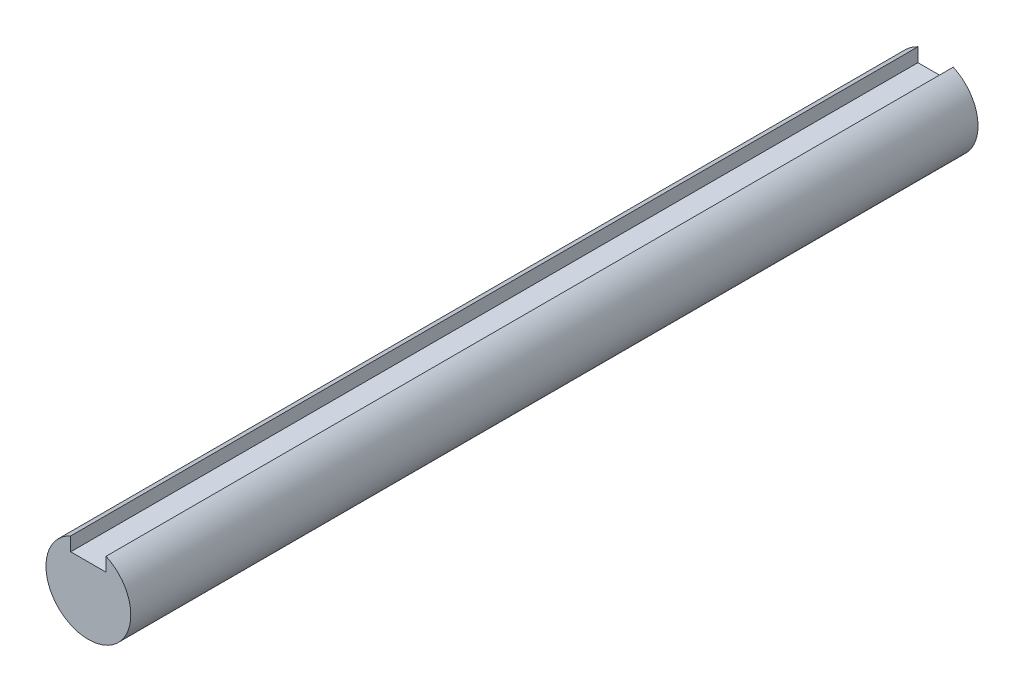
ISO-10303-21;
HEADER;
FILE_DESCRIPTION(('STEP AP214'),'2;1');
FILE_NAME('part.step','',(''),(''),'','','');
FILE_SCHEMA(('AUTOMOTIVE_DESIGN { 1 0 10303 214 1 1 1 1 }'));
ENDSEC;
DATA;
#1=APPLICATION_CONTEXT('core data for automotive mechanical design processes');
#2=APPLICATION_PROTOCOL_DEFINITION('international standard','automotive_design',2000,#1);
#3=PRODUCT_CONTEXT('',#1,'mechanical');
#4=PRODUCT('Part','Part','',(#3));
#5=PRODUCT_RELATED_PRODUCT_CATEGORY('part','',(#4));
#6=PRODUCT_DEFINITION_FORMATION('','',#4);
#7=PRODUCT_DEFINITION_CONTEXT('part definition',#1,'design');
#8=PRODUCT_DEFINITION('design','',#6,#7);
#9=PRODUCT_DEFINITION_SHAPE('','',#8);
#10=(LENGTH_UNIT() NAMED_UNIT(*) SI_UNIT(.MILLI.,.METRE.));
#11=(NAMED_UNIT(*) PLANE_ANGLE_UNIT() SI_UNIT($,.RADIAN.));
#12=(NAMED_UNIT(*) SI_UNIT($,.STERADIAN.) SOLID_ANGLE_UNIT());
#13=UNCERTAINTY_MEASURE_WITH_UNIT(LENGTH_MEASURE(1.E-05),#10,'distance_accuracy_value','');
#14=(GEOMETRIC_REPRESENTATION_CONTEXT(3) GLOBAL_UNCERTAINTY_ASSIGNED_CONTEXT((#13)) GLOBAL_UNIT_ASSIGNED_CONTEXT((#10,
#11,#12)) REPRESENTATION_CONTEXT('',''));
#15=CARTESIAN_POINT('',(0.,0.,0.));
#16=DIRECTION('',(0.,0.,1.));
#17=DIRECTION('',(1.,0.,0.));
#18=AXIS2_PLACEMENT_3D('',#15,#16,#17);
#19=CARTESIAN_POINT('',(-2.5,0.,59.944));
#20=DIRECTION('',(1.,0.,0.));
#21=DIRECTION('',(0.,1.,0.));
#22=AXIS2_PLACEMENT_3D('',#19,#20,#21);
#23=PLANE('',#22);
#24=DIRECTION('',(0.,-1.,0.));
#25=VECTOR('',#24,1.);
#26=CARTESIAN_POINT('',(-2.5,0.,-59.944));
#27=LINE('',#26,#25);
#28=CARTESIAN_POINT('',(-2.5,5.45435605731786,-59.944));
#29=VERTEX_POINT('',#28);
#30=CARTESIAN_POINT('',(-2.5,3.5,-59.944));
#31=VERTEX_POINT('',#30);
#32=EDGE_CURVE('E101',#29,#31,#27,.T.);
#33=ORIENTED_EDGE('',*,*,#32,.F.);
#34=DIRECTION('',(0.,0.,-1.));
#35=VECTOR('',#34,1.);
#36=CARTESIAN_POINT('',(-2.5,5.45435605731786,59.944));
#37=LINE('',#36,#35);
#38=CARTESIAN_POINT('',(-2.5,5.45435605731786,59.944));
#39=VERTEX_POINT('',#38);
#40=EDGE_CURVE('E11',#39,#29,#37,.T.);
#41=ORIENTED_EDGE('',*,*,#40,.F.);
#42=DIRECTION('',(0.,-1.,0.));
#43=VECTOR('',#42,1.);
#44=CARTESIAN_POINT('',(-2.5,0.,59.944));
#45=LINE('',#44,#43);
#46=CARTESIAN_POINT('',(-2.5,3.5,59.944));
#47=VERTEX_POINT('',#46);
#48=EDGE_CURVE('E86',#39,#47,#45,.T.);
#49=ORIENTED_EDGE('',*,*,#48,.T.);
#50=DIRECTION('',(0.,0.,-1.));
#51=VECTOR('',#50,1.);
#52=CARTESIAN_POINT('',(-2.5,3.5,59.944));
#53=LINE('',#52,#51);
#54=EDGE_CURVE('E54',#47,#31,#53,.T.);
#55=ORIENTED_EDGE('',*,*,#54,.T.);
#56=EDGE_LOOP('',(#33,#41,#49,#55));
#57=FACE_BOUND('',#56,.T.);
#58=ADVANCED_FACE('F38',(#57),#23,.T.);
#59=CARTESIAN_POINT('',(0.,0.,59.944));
#60=DIRECTION('',(0.,0.,-1.));
#61=DIRECTION('',(-1.,0.,0.));
#62=AXIS2_PLACEMENT_3D('',#59,#60,#61);
#63=CYLINDRICAL_SURFACE('',#62,6.);
#64=CARTESIAN_POINT('',(0.,0.,-59.944));
#65=DIRECTION('',(0.,0.,1.));
#66=DIRECTION('',(1.,0.,0.));
#67=AXIS2_PLACEMENT_3D('',#64,#65,#66);
#68=CIRCLE('',#67,6.);
#69=CARTESIAN_POINT('',(2.5,5.45435605731786,-59.944));
#70=VERTEX_POINT('',#69);
#71=EDGE_CURVE('E92',#29,#70,#68,.T.);
#72=ORIENTED_EDGE('',*,*,#71,.T.);
#73=DIRECTION('',(0.,0.,-1.));
#74=VECTOR('',#73,1.);
#75=CARTESIAN_POINT('',(2.5,5.45435605731786,59.944));
#76=LINE('',#75,#74);
#77=CARTESIAN_POINT('',(2.5,5.45435605731786,59.944));
#78=VERTEX_POINT('',#77);
#79=EDGE_CURVE('E46',#78,#70,#76,.T.);
#80=ORIENTED_EDGE('',*,*,#79,.F.);
#81=CARTESIAN_POINT('',(0.,0.,59.944));
#82=DIRECTION('',(0.,0.,1.));
#83=DIRECTION('',(1.,0.,0.));
#84=AXIS2_PLACEMENT_3D('',#81,#82,#83);
#85=CIRCLE('',#84,6.);
#86=EDGE_CURVE('E80',#39,#78,#85,.T.);
#87=ORIENTED_EDGE('',*,*,#86,.F.);
#88=ORIENTED_EDGE('',*,*,#40,.T.);
#89=EDGE_LOOP('',(#72,#80,#87,#88));
#90=FACE_BOUND('',#89,.T.);
#91=ADVANCED_FACE('F90',(#90),#63,.T.);
#92=CARTESIAN_POINT('',(2.5,0.,59.944));
#93=DIRECTION('',(1.,0.,0.));
#94=DIRECTION('',(0.,1.,0.));
#95=AXIS2_PLACEMENT_3D('',#92,#93,#94);
#96=PLANE('',#95);
#97=DIRECTION('',(0.,-1.,0.));
#98=VECTOR('',#97,1.);
#99=CARTESIAN_POINT('',(2.5,0.,-59.944));
#100=LINE('',#99,#98);
#101=CARTESIAN_POINT('',(2.5,3.5,-59.944));
#102=VERTEX_POINT('',#101);
#103=EDGE_CURVE('E104',#70,#102,#100,.T.);
#104=ORIENTED_EDGE('',*,*,#103,.T.);
#105=DIRECTION('',(0.,0.,-1.));
#106=VECTOR('',#105,1.);
#107=CARTESIAN_POINT('',(2.5,3.5,59.944));
#108=LINE('',#107,#106);
#109=CARTESIAN_POINT('',(2.5,3.5,59.944));
#110=VERTEX_POINT('',#109);
#111=EDGE_CURVE('E68',#110,#102,#108,.T.);
#112=ORIENTED_EDGE('',*,*,#111,.F.);
#113=DIRECTION('',(0.,-1.,0.));
#114=VECTOR('',#113,1.);
#115=CARTESIAN_POINT('',(2.5,0.,59.944));
#116=LINE('',#115,#114);
#117=EDGE_CURVE('E85',#78,#110,#116,.T.);
#118=ORIENTED_EDGE('',*,*,#117,.F.);
#119=ORIENTED_EDGE('',*,*,#79,.T.);
#120=EDGE_LOOP('',(#104,#112,#118,#119));
#121=FACE_BOUND('',#120,.T.);
#122=ADVANCED_FACE('F95',(#121),#96,.F.);
#123=CARTESIAN_POINT('',(0.,3.5,59.944));
#124=DIRECTION('',(0.,1.,0.));
#125=DIRECTION('',(0.,0.,1.));
#126=AXIS2_PLACEMENT_3D('',#123,#124,#125);
#127=PLANE('',#126);
#128=DIRECTION('',(1.,0.,0.));
#129=VECTOR('',#128,1.);
#130=CARTESIAN_POINT('',(0.,3.5,-59.944));
#131=LINE('',#130,#129);
#132=EDGE_CURVE('E106',#31,#102,#131,.T.);
#133=ORIENTED_EDGE('',*,*,#132,.F.);
#134=ORIENTED_EDGE('',*,*,#54,.F.);
#135=DIRECTION('',(1.,0.,0.));
#136=VECTOR('',#135,1.);
#137=CARTESIAN_POINT('',(0.,3.5,59.944));
#138=LINE('',#137,#136);
#139=EDGE_CURVE('E96',#47,#110,#138,.T.);
#140=ORIENTED_EDGE('',*,*,#139,.T.);
#141=ORIENTED_EDGE('',*,*,#111,.T.);
#142=EDGE_LOOP('',(#133,#134,#140,#141));
#143=FACE_BOUND('',#142,.T.);
#144=ADVANCED_FACE('F111',(#143),#127,.T.);
#145=CARTESIAN_POINT('',(0.,0.,59.944));
#146=DIRECTION('',(0.,0.,1.));
#147=DIRECTION('',(1.,0.,0.));
#148=AXIS2_PLACEMENT_3D('',#145,#146,#147);
#149=PLANE('',#148);
#150=ORIENTED_EDGE('',*,*,#48,.F.);
#151=ORIENTED_EDGE('',*,*,#86,.T.);
#152=ORIENTED_EDGE('',*,*,#117,.T.);
#153=ORIENTED_EDGE('',*,*,#139,.F.);
#154=EDGE_LOOP('',(#150,#151,#152,#153));
#155=FACE_BOUND('',#154,.T.);
#156=ADVANCED_FACE('F82',(#155),#149,.T.);
#157=CARTESIAN_POINT('',(0.,0.,-59.944));
#158=DIRECTION('',(0.,0.,1.));
#159=DIRECTION('',(1.,0.,0.));
#160=AXIS2_PLACEMENT_3D('',#157,#158,#159);
#161=PLANE('',#160);
#162=ORIENTED_EDGE('',*,*,#32,.T.);
#163=ORIENTED_EDGE('',*,*,#132,.T.);
#164=ORIENTED_EDGE('',*,*,#103,.F.);
#165=ORIENTED_EDGE('',*,*,#71,.F.);
#166=EDGE_LOOP('',(#162,#163,#164,#165));
#167=FACE_BOUND('',#166,.T.);
#168=ADVANCED_FACE('F118',(#167),#161,.F.);
#169=CLOSED_SHELL('',(#58,#91,#122,#144,#156,#168));
#170=MANIFOLD_SOLID_BREP('B2',#169);
#171=ADVANCED_BREP_SHAPE_REPRESENTATION('',(#18,#170),#14);
#172=SHAPE_DEFINITION_REPRESENTATION(#9,#171);
ENDSEC;
END-ISO-10303-21;
